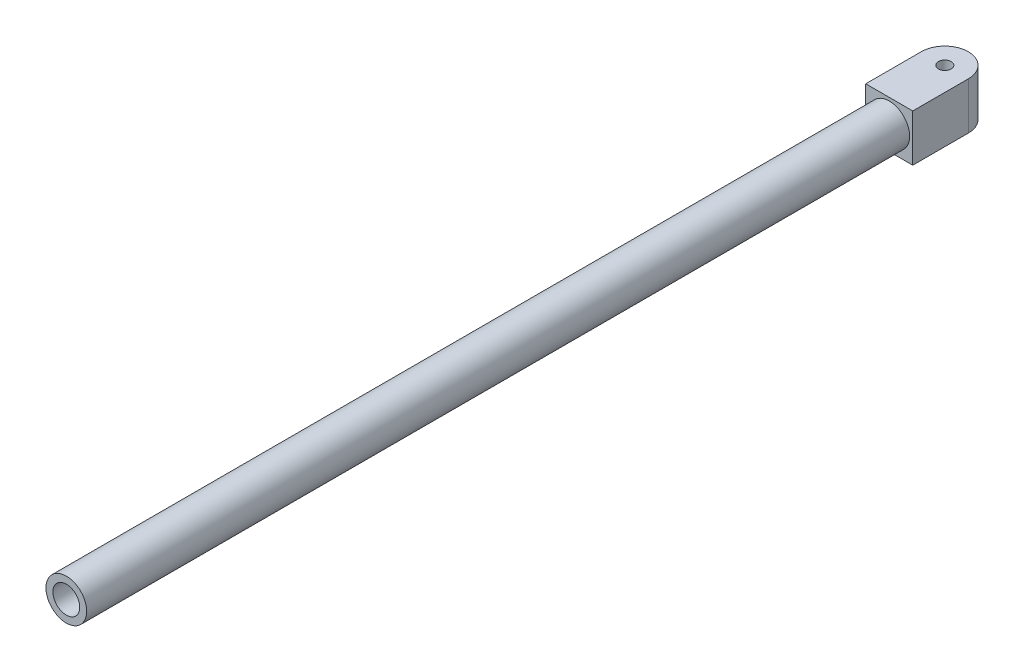
ISO-10303-21;
HEADER;
FILE_DESCRIPTION(('STEP AP214'),'2;1');
FILE_NAME('part.step','',(''),(''),'','','');
FILE_SCHEMA(('AUTOMOTIVE_DESIGN { 1 0 10303 214 1 1 1 1 }'));
ENDSEC;
DATA;
#1=APPLICATION_CONTEXT('core data for automotive mechanical design processes');
#2=APPLICATION_PROTOCOL_DEFINITION('international standard','automotive_design',2000,#1);
#3=PRODUCT_CONTEXT('',#1,'mechanical');
#4=PRODUCT('Part','Part','',(#3));
#5=PRODUCT_RELATED_PRODUCT_CATEGORY('part','',(#4));
#6=PRODUCT_DEFINITION_FORMATION('','',#4);
#7=PRODUCT_DEFINITION_CONTEXT('part definition',#1,'design');
#8=PRODUCT_DEFINITION('design','',#6,#7);
#9=PRODUCT_DEFINITION_SHAPE('','',#8);
#10=(LENGTH_UNIT() NAMED_UNIT(*) SI_UNIT(.MILLI.,.METRE.));
#11=(NAMED_UNIT(*) PLANE_ANGLE_UNIT() SI_UNIT($,.RADIAN.));
#12=(NAMED_UNIT(*) SI_UNIT($,.STERADIAN.) SOLID_ANGLE_UNIT());
#13=UNCERTAINTY_MEASURE_WITH_UNIT(LENGTH_MEASURE(1.E-05),#10,'distance_accuracy_value','');
#14=(GEOMETRIC_REPRESENTATION_CONTEXT(3) GLOBAL_UNCERTAINTY_ASSIGNED_CONTEXT((#13)) GLOBAL_UNIT_ASSIGNED_CONTEXT((#10,
#11,#12)) REPRESENTATION_CONTEXT('',''));
#15=CARTESIAN_POINT('',(0.,0.,0.));
#16=DIRECTION('',(0.,0.,1.));
#17=DIRECTION('',(1.,0.,0.));
#18=AXIS2_PLACEMENT_3D('',#15,#16,#17);
#19=CARTESIAN_POINT('',(11.,11.,15.));
#20=DIRECTION('',(1.,0.,0.));
#21=DIRECTION('',(0.,1.,0.));
#22=AXIS2_PLACEMENT_3D('',#19,#20,#21);
#23=PLANE('',#22);
#24=DIRECTION('',(0.,0.,-1.));
#25=VECTOR('',#24,1.);
#26=CARTESIAN_POINT('',(11.,-11.,15.));
#27=LINE('',#26,#25);
#28=CARTESIAN_POINT('',(11.,-11.,15.));
#29=VERTEX_POINT('',#28);
#30=CARTESIAN_POINT('',(11.,-11.,-11.));
#31=VERTEX_POINT('',#30);
#32=EDGE_CURVE('E52',#29,#31,#27,.T.);
#33=ORIENTED_EDGE('',*,*,#32,.T.);
#34=DIRECTION('',(0.,-1.,0.));
#35=VECTOR('',#34,1.);
#36=CARTESIAN_POINT('',(11.,40.732137494637,-11.));
#37=LINE('',#36,#35);
#38=CARTESIAN_POINT('',(11.,11.,-11.));
#39=VERTEX_POINT('',#38);
#40=EDGE_CURVE('E104',#39,#31,#37,.T.);
#41=ORIENTED_EDGE('',*,*,#40,.F.);
#42=DIRECTION('',(0.,0.,-1.));
#43=VECTOR('',#42,1.);
#44=CARTESIAN_POINT('',(11.,11.,15.));
#45=LINE('',#44,#43);
#46=CARTESIAN_POINT('',(11.,11.,15.));
#47=VERTEX_POINT('',#46);
#48=EDGE_CURVE('E12',#47,#39,#45,.T.);
#49=ORIENTED_EDGE('',*,*,#48,.F.);
#50=DIRECTION('',(0.,-1.,0.));
#51=VECTOR('',#50,1.);
#52=CARTESIAN_POINT('',(11.,11.,15.));
#53=LINE('',#52,#51);
#54=EDGE_CURVE('E122',#47,#29,#53,.T.);
#55=ORIENTED_EDGE('',*,*,#54,.T.);
#56=EDGE_LOOP('',(#33,#41,#49,#55));
#57=FACE_BOUND('',#56,.T.);
#58=ADVANCED_FACE('F49',(#57),#23,.T.);
#59=CARTESIAN_POINT('',(11.,11.,15.));
#60=DIRECTION('',(0.,1.,0.));
#61=DIRECTION('',(0.,0.,1.));
#62=AXIS2_PLACEMENT_3D('',#59,#60,#61);
#63=PLANE('',#62);
#64=ORIENTED_EDGE('',*,*,#48,.T.);
#65=CARTESIAN_POINT('',(0.,11.,-11.));
#66=DIRECTION('',(0.,1.,0.));
#67=DIRECTION('',(0.,0.,1.));
#68=AXIS2_PLACEMENT_3D('',#65,#66,#67);
#69=CIRCLE('',#68,11.);
#70=CARTESIAN_POINT('',(-11.,11.,-11.));
#71=VERTEX_POINT('',#70);
#72=EDGE_CURVE('E99',#71,#39,#69,.F.);
#73=ORIENTED_EDGE('',*,*,#72,.F.);
#74=DIRECTION('',(0.,0.,-1.));
#75=VECTOR('',#74,1.);
#76=CARTESIAN_POINT('',(-11.,11.,15.));
#77=LINE('',#76,#75);
#78=CARTESIAN_POINT('',(-11.,11.,15.));
#79=VERTEX_POINT('',#78);
#80=EDGE_CURVE('E57',#79,#71,#77,.T.);
#81=ORIENTED_EDGE('',*,*,#80,.F.);
#82=DIRECTION('',(1.,0.,0.));
#83=VECTOR('',#82,1.);
#84=CARTESIAN_POINT('',(11.,11.,15.));
#85=LINE('',#84,#83);
#86=EDGE_CURVE('E128',#79,#47,#85,.T.);
#87=ORIENTED_EDGE('',*,*,#86,.T.);
#88=EDGE_LOOP('',(#64,#73,#81,#87));
#89=FACE_BOUND('',#88,.T.);
#90=CARTESIAN_POINT('',(0.,11.,-11.));
#91=DIRECTION('',(0.,1.,0.));
#92=DIRECTION('',(0.,0.,1.));
#93=AXIS2_PLACEMENT_3D('',#90,#91,#92);
#94=CIRCLE('',#93,3.);
#95=CARTESIAN_POINT('',(0.,11.,-8.));
#96=VERTEX_POINT('',#95);
#97=EDGE_CURVE('E119',#96,#96,#94,.F.);
#98=ORIENTED_EDGE('',*,*,#97,.T.);
#99=EDGE_LOOP('',(#98));
#100=FACE_BOUND('',#99,.T.);
#101=ADVANCED_FACE('F100',(#89,#100),#63,.T.);
#102=CARTESIAN_POINT('',(-11.,11.,15.));
#103=DIRECTION('',(-1.,0.,0.));
#104=DIRECTION('',(0.,-1.,0.));
#105=AXIS2_PLACEMENT_3D('',#102,#103,#104);
#106=PLANE('',#105);
#107=ORIENTED_EDGE('',*,*,#80,.T.);
#108=DIRECTION('',(0.,-1.,0.));
#109=VECTOR('',#108,1.);
#110=CARTESIAN_POINT('',(-11.,40.732137494637,-11.));
#111=LINE('',#110,#109);
#112=CARTESIAN_POINT('',(-11.,-11.,-11.));
#113=VERTEX_POINT('',#112);
#114=EDGE_CURVE('E91',#71,#113,#111,.T.);
#115=ORIENTED_EDGE('',*,*,#114,.T.);
#116=DIRECTION('',(0.,0.,-1.));
#117=VECTOR('',#116,1.);
#118=CARTESIAN_POINT('',(-11.,-11.,15.));
#119=LINE('',#118,#117);
#120=CARTESIAN_POINT('',(-11.,-11.,15.));
#121=VERTEX_POINT('',#120);
#122=EDGE_CURVE('E96',#121,#113,#119,.T.);
#123=ORIENTED_EDGE('',*,*,#122,.F.);
#124=DIRECTION('',(0.,1.,0.));
#125=VECTOR('',#124,1.);
#126=CARTESIAN_POINT('',(-11.,11.,15.));
#127=LINE('',#126,#125);
#128=EDGE_CURVE('E94',#121,#79,#127,.T.);
#129=ORIENTED_EDGE('',*,*,#128,.T.);
#130=EDGE_LOOP('',(#107,#115,#123,#129));
#131=FACE_BOUND('',#130,.T.);
#132=ADVANCED_FACE('F89',(#131),#106,.T.);
#133=CARTESIAN_POINT('',(11.,-11.,15.));
#134=DIRECTION('',(0.,-1.,0.));
#135=DIRECTION('',(0.,0.,-1.));
#136=AXIS2_PLACEMENT_3D('',#133,#134,#135);
#137=PLANE('',#136);
#138=ORIENTED_EDGE('',*,*,#122,.T.);
#139=CARTESIAN_POINT('',(0.,-11.,-11.));
#140=DIRECTION('',(0.,-1.,0.));
#141=DIRECTION('',(0.,0.,-1.));
#142=AXIS2_PLACEMENT_3D('',#139,#140,#141);
#143=CIRCLE('',#142,11.);
#144=EDGE_CURVE('E108',#113,#31,#143,.T.);
#145=ORIENTED_EDGE('',*,*,#144,.T.);
#146=ORIENTED_EDGE('',*,*,#32,.F.);
#147=DIRECTION('',(-1.,0.,0.));
#148=VECTOR('',#147,1.);
#149=CARTESIAN_POINT('',(11.,-11.,15.));
#150=LINE('',#149,#148);
#151=EDGE_CURVE('E124',#29,#121,#150,.T.);
#152=ORIENTED_EDGE('',*,*,#151,.T.);
#153=EDGE_LOOP('',(#138,#145,#146,#152));
#154=FACE_BOUND('',#153,.T.);
#155=CARTESIAN_POINT('',(0.,-11.,-11.));
#156=DIRECTION('',(0.,-1.,0.));
#157=DIRECTION('',(0.,0.,-1.));
#158=AXIS2_PLACEMENT_3D('',#155,#156,#157);
#159=CIRCLE('',#158,3.);
#160=CARTESIAN_POINT('',(0.,-11.,-14.));
#161=VERTEX_POINT('',#160);
#162=EDGE_CURVE('E109',#161,#161,#159,.T.);
#163=ORIENTED_EDGE('',*,*,#162,.F.);
#164=EDGE_LOOP('',(#163));
#165=FACE_BOUND('',#164,.T.);
#166=ADVANCED_FACE('F131',(#154,#165),#137,.T.);
#167=CARTESIAN_POINT('',(0.,0.,15.));
#168=DIRECTION('',(0.,0.,-1.));
#169=DIRECTION('',(-1.,0.,0.));
#170=AXIS2_PLACEMENT_3D('',#167,#168,#169);
#171=PLANE('',#170);
#172=CARTESIAN_POINT('',(0.,0.,15.));
#173=DIRECTION('',(0.,0.,-1.));
#174=DIRECTION('',(-1.,0.,0.));
#175=AXIS2_PLACEMENT_3D('',#172,#173,#174);
#176=CIRCLE('',#175,9.525);
#177=CARTESIAN_POINT('',(-9.525,0.,15.));
#178=VERTEX_POINT('',#177);
#179=EDGE_CURVE('E118',#178,#178,#176,.T.);
#180=ORIENTED_EDGE('',*,*,#179,.T.);
#181=EDGE_LOOP('',(#180));
#182=FACE_BOUND('',#181,.T.);
#183=ORIENTED_EDGE('',*,*,#54,.F.);
#184=ORIENTED_EDGE('',*,*,#86,.F.);
#185=ORIENTED_EDGE('',*,*,#128,.F.);
#186=ORIENTED_EDGE('',*,*,#151,.F.);
#187=EDGE_LOOP('',(#183,#184,#185,#186));
#188=FACE_BOUND('',#187,.T.);
#189=ADVANCED_FACE('F158',(#182,#188),#171,.F.);
#190=CARTESIAN_POINT('',(0.,0.,15.));
#191=DIRECTION('',(0.,0.,-1.));
#192=DIRECTION('',(-1.,0.,0.));
#193=AXIS2_PLACEMENT_3D('',#190,#191,#192);
#194=CYLINDRICAL_SURFACE('',#193,9.525);
#195=ORIENTED_EDGE('',*,*,#179,.F.);
#196=EDGE_LOOP('',(#195));
#197=FACE_BOUND('',#196,.T.);
#198=CARTESIAN_POINT('',(0.,0.,0.));
#199=DIRECTION('',(0.,0.,-1.));
#200=DIRECTION('',(-1.,0.,0.));
#201=AXIS2_PLACEMENT_3D('',#198,#199,#200);
#202=CIRCLE('',#201,9.525);
#203=CARTESIAN_POINT('',(-9.525,0.,0.));
#204=VERTEX_POINT('',#203);
#205=EDGE_CURVE('E115',#204,#204,#202,.F.);
#206=ORIENTED_EDGE('',*,*,#205,.F.);
#207=EDGE_LOOP('',(#206));
#208=FACE_BOUND('',#207,.T.);
#209=ADVANCED_FACE('F164',(#197,#208),#194,.F.);
#210=CARTESIAN_POINT('',(0.,0.,0.));
#211=DIRECTION('',(0.,0.,-1.));
#212=DIRECTION('',(-1.,0.,0.));
#213=AXIS2_PLACEMENT_3D('',#210,#211,#212);
#214=PLANE('',#213);
#215=ORIENTED_EDGE('',*,*,#205,.T.);
#216=EDGE_LOOP('',(#215));
#217=FACE_BOUND('',#216,.T.);
#218=ADVANCED_FACE('F145',(#217),#214,.F.);
#219=CARTESIAN_POINT('',(0.,40.732137494637,-11.));
#220=DIRECTION('',(0.,-1.,0.));
#221=DIRECTION('',(0.,0.,-1.));
#222=AXIS2_PLACEMENT_3D('',#219,#220,#221);
#223=CYLINDRICAL_SURFACE('',#222,11.);
#224=ORIENTED_EDGE('',*,*,#114,.F.);
#225=ORIENTED_EDGE('',*,*,#72,.T.);
#226=ORIENTED_EDGE('',*,*,#40,.T.);
#227=ORIENTED_EDGE('',*,*,#144,.F.);
#228=EDGE_LOOP('',(#224,#225,#226,#227));
#229=FACE_BOUND('',#228,.T.);
#230=ADVANCED_FACE('F106',(#229),#223,.T.);
#231=CARTESIAN_POINT('',(0.,40.732137494637,-11.));
#232=DIRECTION('',(0.,-1.,0.));
#233=DIRECTION('',(0.,0.,-1.));
#234=AXIS2_PLACEMENT_3D('',#231,#232,#233);
#235=CYLINDRICAL_SURFACE('',#234,3.);
#236=ORIENTED_EDGE('',*,*,#162,.T.);
#237=EDGE_LOOP('',(#236));
#238=FACE_BOUND('',#237,.T.);
#239=ORIENTED_EDGE('',*,*,#97,.F.);
#240=EDGE_LOOP('',(#239));
#241=FACE_BOUND('',#240,.T.);
#242=ADVANCED_FACE('F138',(#238,#241),#235,.F.);
#243=CLOSED_SHELL('',(#58,#101,#132,#166,#189,#209,#218,#230,#242));
#244=MANIFOLD_SOLID_BREP('B2',#243);
#245=CARTESIAN_POINT('',(0.,0.,400.));
#246=DIRECTION('',(0.,0.,1.));
#247=DIRECTION('',(1.,0.,0.));
#248=AXIS2_PLACEMENT_3D('',#245,#246,#247);
#249=PLANE('',#248);
#250=CARTESIAN_POINT('',(0.,0.,400.));
#251=DIRECTION('',(0.,0.,1.));
#252=DIRECTION('',(1.,0.,0.));
#253=AXIS2_PLACEMENT_3D('',#250,#251,#252);
#254=CIRCLE('',#253,9.525);
#255=CARTESIAN_POINT('',(9.525,0.,400.));
#256=VERTEX_POINT('',#255);
#257=EDGE_CURVE('E48',#256,#256,#254,.T.);
#258=ORIENTED_EDGE('',*,*,#257,.T.);
#259=EDGE_LOOP('',(#258));
#260=FACE_BOUND('',#259,.T.);
#261=CARTESIAN_POINT('',(0.,0.,400.));
#262=DIRECTION('',(0.,0.,1.));
#263=DIRECTION('',(1.,0.,0.));
#264=AXIS2_PLACEMENT_3D('',#261,#262,#263);
#265=CIRCLE('',#264,6.2738);
#266=CARTESIAN_POINT('',(6.2738,0.,400.));
#267=VERTEX_POINT('',#266);
#268=EDGE_CURVE('E264',#267,#267,#265,.T.);
#269=ORIENTED_EDGE('',*,*,#268,.F.);
#270=EDGE_LOOP('',(#269));
#271=FACE_BOUND('',#270,.T.);
#272=ADVANCED_FACE('F253',(#260,#271),#249,.T.);
#273=CARTESIAN_POINT('',(0.,0.,0.));
#274=DIRECTION('',(0.,0.,1.));
#275=DIRECTION('',(1.,0.,0.));
#276=AXIS2_PLACEMENT_3D('',#273,#274,#275);
#277=PLANE('',#276);
#278=CARTESIAN_POINT('',(0.,0.,0.));
#279=DIRECTION('',(0.,0.,1.));
#280=DIRECTION('',(1.,0.,0.));
#281=AXIS2_PLACEMENT_3D('',#278,#279,#280);
#282=CIRCLE('',#281,9.525);
#283=CARTESIAN_POINT('',(9.525,0.,0.));
#284=VERTEX_POINT('',#283);
#285=EDGE_CURVE('E257',#284,#284,#282,.T.);
#286=ORIENTED_EDGE('',*,*,#285,.F.);
#287=EDGE_LOOP('',(#286));
#288=FACE_BOUND('',#287,.T.);
#289=CARTESIAN_POINT('',(0.,0.,0.));
#290=DIRECTION('',(0.,0.,1.));
#291=DIRECTION('',(1.,0.,0.));
#292=AXIS2_PLACEMENT_3D('',#289,#290,#291);
#293=CIRCLE('',#292,6.2738);
#294=CARTESIAN_POINT('',(6.2738,0.,0.));
#295=VERTEX_POINT('',#294);
#296=EDGE_CURVE('E266',#295,#295,#293,.T.);
#297=ORIENTED_EDGE('',*,*,#296,.T.);
#298=EDGE_LOOP('',(#297));
#299=FACE_BOUND('',#298,.T.);
#300=ADVANCED_FACE('F276',(#288,#299),#277,.F.);
#301=CARTESIAN_POINT('',(0.,0.,400.));
#302=DIRECTION('',(0.,0.,-1.));
#303=DIRECTION('',(-1.,0.,0.));
#304=AXIS2_PLACEMENT_3D('',#301,#302,#303);
#305=CYLINDRICAL_SURFACE('',#304,9.525);
#306=ORIENTED_EDGE('',*,*,#257,.F.);
#307=EDGE_LOOP('',(#306));
#308=FACE_BOUND('',#307,.T.);
#309=ORIENTED_EDGE('',*,*,#285,.T.);
#310=EDGE_LOOP('',(#309));
#311=FACE_BOUND('',#310,.T.);
#312=ADVANCED_FACE('F255',(#308,#311),#305,.T.);
#313=CARTESIAN_POINT('',(0.,0.,400.));
#314=DIRECTION('',(0.,0.,-1.));
#315=DIRECTION('',(-1.,0.,0.));
#316=AXIS2_PLACEMENT_3D('',#313,#314,#315);
#317=CYLINDRICAL_SURFACE('',#316,6.2738);
#318=ORIENTED_EDGE('',*,*,#268,.T.);
#319=EDGE_LOOP('',(#318));
#320=FACE_BOUND('',#319,.T.);
#321=ORIENTED_EDGE('',*,*,#296,.F.);
#322=EDGE_LOOP('',(#321));
#323=FACE_BOUND('',#322,.T.);
#324=ADVANCED_FACE('F272',(#320,#323),#317,.F.);
#325=CLOSED_SHELL('',(#272,#300,#312,#324));
#326=MANIFOLD_SOLID_BREP('B6',#325);
#327=ADVANCED_BREP_SHAPE_REPRESENTATION('',(#18,#244,#326),#14);
#328=SHAPE_DEFINITION_REPRESENTATION(#9,#327);
ENDSEC;
END-ISO-10303-21;
